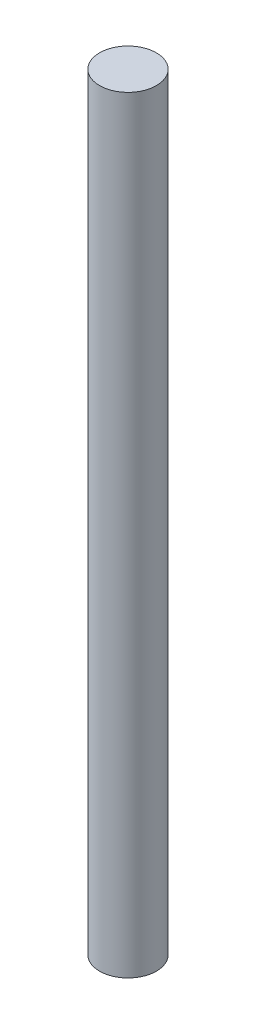
ISO-10303-21;
HEADER;
FILE_DESCRIPTION(('STEP AP214'),'2;1');
FILE_NAME('part.step','',(''),(''),'','','');
FILE_SCHEMA(('AUTOMOTIVE_DESIGN { 1 0 10303 214 1 1 1 1 }'));
ENDSEC;
DATA;
#1=APPLICATION_CONTEXT('core data for automotive mechanical design processes');
#2=APPLICATION_PROTOCOL_DEFINITION('international standard','automotive_design',2000,#1);
#3=PRODUCT_CONTEXT('',#1,'mechanical');
#4=PRODUCT('Part','Part','',(#3));
#5=PRODUCT_RELATED_PRODUCT_CATEGORY('part','',(#4));
#6=PRODUCT_DEFINITION_FORMATION('','',#4);
#7=PRODUCT_DEFINITION_CONTEXT('part definition',#1,'design');
#8=PRODUCT_DEFINITION('design','',#6,#7);
#9=PRODUCT_DEFINITION_SHAPE('','',#8);
#10=(LENGTH_UNIT() NAMED_UNIT(*) SI_UNIT(.MILLI.,.METRE.));
#11=(NAMED_UNIT(*) PLANE_ANGLE_UNIT() SI_UNIT($,.RADIAN.));
#12=(NAMED_UNIT(*) SI_UNIT($,.STERADIAN.) SOLID_ANGLE_UNIT());
#13=UNCERTAINTY_MEASURE_WITH_UNIT(LENGTH_MEASURE(1.E-05),#10,'distance_accuracy_value','');
#14=(GEOMETRIC_REPRESENTATION_CONTEXT(3) GLOBAL_UNCERTAINTY_ASSIGNED_CONTEXT((#13)) GLOBAL_UNIT_ASSIGNED_CONTEXT((#10,
#11,#12)) REPRESENTATION_CONTEXT('',''));
#15=CARTESIAN_POINT('',(0.,0.,0.));
#16=DIRECTION('',(0.,0.,1.));
#17=DIRECTION('',(1.,0.,0.));
#18=AXIS2_PLACEMENT_3D('',#15,#16,#17);
#19=CARTESIAN_POINT('',(0.,300.,0.));
#20=DIRECTION('',(0.,-1.,0.));
#21=DIRECTION('',(0.,0.,-1.));
#22=AXIS2_PLACEMENT_3D('',#19,#20,#21);
#23=CYLINDRICAL_SURFACE('',#22,11.1125);
#24=CARTESIAN_POINT('',(0.,300.,0.));
#25=DIRECTION('',(0.,1.,0.));
#26=DIRECTION('',(0.,0.,1.));
#27=AXIS2_PLACEMENT_3D('',#24,#25,#26);
#28=CIRCLE('',#27,11.1125);
#29=CARTESIAN_POINT('',(0.,300.,11.1125));
#30=VERTEX_POINT('',#29);
#31=EDGE_CURVE('E10',#30,#30,#28,.T.);
#32=ORIENTED_EDGE('',*,*,#31,.F.);
#33=EDGE_LOOP('',(#32));
#34=FACE_BOUND('',#33,.T.);
#35=CARTESIAN_POINT('',(0.,0.,0.));
#36=DIRECTION('',(0.,1.,0.));
#37=DIRECTION('',(0.,0.,1.));
#38=AXIS2_PLACEMENT_3D('',#35,#36,#37);
#39=CIRCLE('',#38,11.1125);
#40=CARTESIAN_POINT('',(0.,0.,11.1125));
#41=VERTEX_POINT('',#40);
#42=EDGE_CURVE('E40',#41,#41,#39,.T.);
#43=ORIENTED_EDGE('',*,*,#42,.T.);
#44=EDGE_LOOP('',(#43));
#45=FACE_BOUND('',#44,.T.);
#46=ADVANCED_FACE('F37',(#34,#45),#23,.T.);
#47=CARTESIAN_POINT('',(0.,300.,0.));
#48=DIRECTION('',(0.,1.,0.));
#49=DIRECTION('',(0.,0.,1.));
#50=AXIS2_PLACEMENT_3D('',#47,#48,#49);
#51=PLANE('',#50);
#52=ORIENTED_EDGE('',*,*,#31,.T.);
#53=EDGE_LOOP('',(#52));
#54=FACE_BOUND('',#53,.T.);
#55=ADVANCED_FACE('F54',(#54),#51,.T.);
#56=CARTESIAN_POINT('',(0.,0.,0.));
#57=DIRECTION('',(0.,1.,0.));
#58=DIRECTION('',(0.,0.,1.));
#59=AXIS2_PLACEMENT_3D('',#56,#57,#58);
#60=PLANE('',#59);
#61=ORIENTED_EDGE('',*,*,#42,.F.);
#62=EDGE_LOOP('',(#61));
#63=FACE_BOUND('',#62,.T.);
#64=ADVANCED_FACE('F52',(#63),#60,.F.);
#65=CLOSED_SHELL('',(#46,#55,#64));
#66=MANIFOLD_SOLID_BREP('B2',#65);
#67=ADVANCED_BREP_SHAPE_REPRESENTATION('',(#18,#66),#14);
#68=SHAPE_DEFINITION_REPRESENTATION(#9,#67);
ENDSEC;
END-ISO-10303-21;
